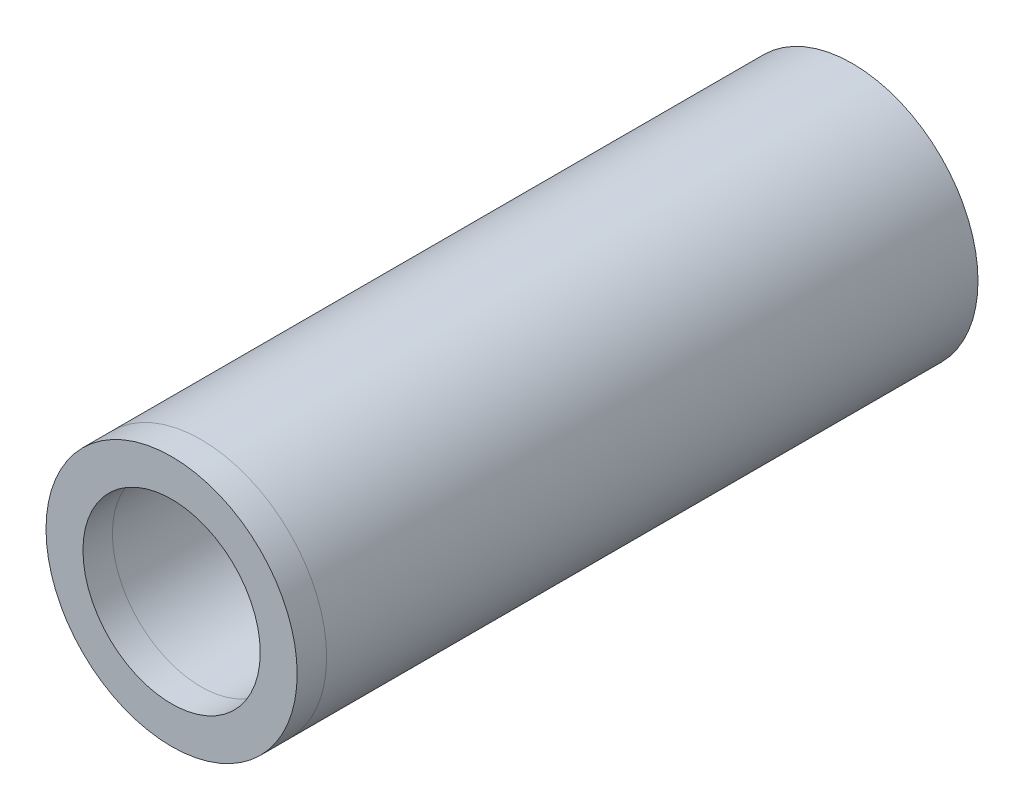
ISO-10303-21;
HEADER;
FILE_DESCRIPTION(('STEP AP214'),'2;1');
FILE_NAME('part.step','',(''),(''),'','','');
FILE_SCHEMA(('AUTOMOTIVE_DESIGN { 1 0 10303 214 1 1 1 1 }'));
ENDSEC;
DATA;
#1=APPLICATION_CONTEXT('core data for automotive mechanical design processes');
#2=APPLICATION_PROTOCOL_DEFINITION('international standard','automotive_design',2000,#1);
#3=PRODUCT_CONTEXT('',#1,'mechanical');
#4=PRODUCT('Part','Part','',(#3));
#5=PRODUCT_RELATED_PRODUCT_CATEGORY('part','',(#4));
#6=PRODUCT_DEFINITION_FORMATION('','',#4);
#7=PRODUCT_DEFINITION_CONTEXT('part definition',#1,'design');
#8=PRODUCT_DEFINITION('design','',#6,#7);
#9=PRODUCT_DEFINITION_SHAPE('','',#8);
#10=(LENGTH_UNIT() NAMED_UNIT(*) SI_UNIT(.MILLI.,.METRE.));
#11=(NAMED_UNIT(*) PLANE_ANGLE_UNIT() SI_UNIT($,.RADIAN.));
#12=(NAMED_UNIT(*) SI_UNIT($,.STERADIAN.) SOLID_ANGLE_UNIT());
#13=UNCERTAINTY_MEASURE_WITH_UNIT(LENGTH_MEASURE(1.E-05),#10,'distance_accuracy_value','');
#14=(GEOMETRIC_REPRESENTATION_CONTEXT(3) GLOBAL_UNCERTAINTY_ASSIGNED_CONTEXT((#13)) GLOBAL_UNIT_ASSIGNED_CONTEXT((#10,
#11,#12)) REPRESENTATION_CONTEXT('',''));
#15=CARTESIAN_POINT('',(0.,0.,0.));
#16=DIRECTION('',(0.,0.,1.));
#17=DIRECTION('',(1.,0.,0.));
#18=AXIS2_PLACEMENT_3D('',#15,#16,#17);
#19=CARTESIAN_POINT('',(-3.14354614503261E-11,0.,0.));
#20=DIRECTION('',(0.,0.,-1.));
#21=DIRECTION('',(-1.,0.,0.));
#22=AXIS2_PLACEMENT_3D('',#19,#20,#21);
#23=PLANE('',#22);
#24=CARTESIAN_POINT('',(-3.14354614503261E-11,0.,0.));
#25=DIRECTION('',(0.,0.,-1.));
#26=DIRECTION('',(-1.,0.,0.));
#27=AXIS2_PLACEMENT_3D('',#24,#25,#26);
#28=CIRCLE('',#27,9.525);
#29=CARTESIAN_POINT('',(-9.52500000003143,0.,0.));
#30=VERTEX_POINT('',#29);
#31=EDGE_CURVE('E71',#30,#30,#28,.T.);
#32=ORIENTED_EDGE('',*,*,#31,.F.);
#33=EDGE_LOOP('',(#32));
#34=FACE_BOUND('',#33,.T.);
#35=CARTESIAN_POINT('',(-3.14354614503261E-11,0.,0.));
#36=DIRECTION('',(0.,0.,-1.));
#37=DIRECTION('',(-1.,0.,0.));
#38=AXIS2_PLACEMENT_3D('',#35,#36,#37);
#39=CIRCLE('',#38,13.49375);
#40=CARTESIAN_POINT('',(-13.4937500000314,0.,0.));
#41=VERTEX_POINT('',#40);
#42=EDGE_CURVE('E67',#41,#41,#39,.T.);
#43=ORIENTED_EDGE('',*,*,#42,.T.);
#44=EDGE_LOOP('',(#43));
#45=FACE_BOUND('',#44,.T.);
#46=ADVANCED_FACE('F57',(#34,#45),#23,.T.);
#47=CARTESIAN_POINT('',(3.00749009030099E-11,0.,73.1504341892945));
#48=DIRECTION('',(0.,0.,-1.));
#49=DIRECTION('',(-1.,0.,0.));
#50=AXIS2_PLACEMENT_3D('',#47,#48,#49);
#51=PLANE('',#50);
#52=CARTESIAN_POINT('',(-1.36056054731628E-12,0.,73.1504341892945));
#53=DIRECTION('',(0.,0.,-1.));
#54=DIRECTION('',(-1.,0.,0.));
#55=AXIS2_PLACEMENT_3D('',#52,#53,#54);
#56=CIRCLE('',#55,9.525);
#57=CARTESIAN_POINT('',(-9.52500000000136,0.,73.1504341892945));
#58=VERTEX_POINT('',#57);
#59=EDGE_CURVE('E76',#58,#58,#56,.T.);
#60=ORIENTED_EDGE('',*,*,#59,.T.);
#61=EDGE_LOOP('',(#60));
#62=FACE_BOUND('',#61,.T.);
#63=CARTESIAN_POINT('',(3.00749009030099E-11,0.,73.1504341892945));
#64=DIRECTION('',(0.,0.,-1.));
#65=DIRECTION('',(-1.,0.,0.));
#66=AXIS2_PLACEMENT_3D('',#63,#64,#65);
#67=CIRCLE('',#66,13.49375);
#68=CARTESIAN_POINT('',(-13.4937499999699,0.,73.1504341892945));
#69=VERTEX_POINT('',#68);
#70=EDGE_CURVE('E11',#69,#69,#67,.T.);
#71=ORIENTED_EDGE('',*,*,#70,.F.);
#72=EDGE_LOOP('',(#71));
#73=FACE_BOUND('',#72,.T.);
#74=ADVANCED_FACE('F83',(#62,#73),#51,.F.);
#75=CARTESIAN_POINT('',(-3.14354614503261E-11,0.,0.));
#76=DIRECTION('',(4.29737181996476E-13,0.,1.));
#77=DIRECTION('',(1.,0.,-4.29737181996476E-13));
#78=AXIS2_PLACEMENT_3D('',#75,#76,#77);
#79=CYLINDRICAL_SURFACE('',#78,13.49375);
#80=CARTESIAN_POINT('',(-1.36056054731617E-12,0.,69.9844048012968));
#81=DIRECTION('',(0.,0.,-1.));
#82=DIRECTION('',(-1.,0.,0.));
#83=AXIS2_PLACEMENT_3D('',#80,#81,#82);
#84=CIRCLE('',#83,13.49375);
#85=CARTESIAN_POINT('',(-13.4937500000014,0.,69.9844048012968));
#86=VERTEX_POINT('',#85);
#87=EDGE_CURVE('E63',#86,#86,#84,.T.);
#88=ORIENTED_EDGE('',*,*,#87,.T.);
#89=EDGE_LOOP('',(#88));
#90=FACE_BOUND('',#89,.T.);
#91=ORIENTED_EDGE('',*,*,#42,.F.);
#92=EDGE_LOOP('',(#91));
#93=FACE_BOUND('',#92,.T.);
#94=ADVANCED_FACE('F103',(#90,#93),#79,.T.);
#95=CARTESIAN_POINT('',(3.00749009030099E-11,0.,69.9844048012968));
#96=DIRECTION('',(0.,0.,1.));
#97=DIRECTION('',(1.,0.,0.));
#98=AXIS2_PLACEMENT_3D('',#95,#96,#97);
#99=CYLINDRICAL_SURFACE('',#98,13.49375);
#100=ORIENTED_EDGE('',*,*,#70,.T.);
#101=EDGE_LOOP('',(#100));
#102=FACE_BOUND('',#101,.T.);
#103=ORIENTED_EDGE('',*,*,#87,.F.);
#104=EDGE_LOOP('',(#103));
#105=FACE_BOUND('',#104,.T.);
#106=ADVANCED_FACE('F95',(#102,#105),#99,.T.);
#107=CARTESIAN_POINT('',(-3.18651986323226E-11,0.,-1.));
#108=DIRECTION('',(4.29737181996476E-13,0.,1.));
#109=DIRECTION('',(1.,0.,-4.29737181996476E-13));
#110=AXIS2_PLACEMENT_3D('',#107,#108,#109);
#111=CYLINDRICAL_SURFACE('',#110,9.525);
#112=CARTESIAN_POINT('',(-1.36056054731618E-12,0.,69.9844048012968));
#113=DIRECTION('',(0.,0.,-1.));
#114=DIRECTION('',(-1.,0.,0.));
#115=AXIS2_PLACEMENT_3D('',#112,#113,#114);
#116=CIRCLE('',#115,9.525);
#117=CARTESIAN_POINT('',(-9.52500000000136,0.,69.9844048012968));
#118=VERTEX_POINT('',#117);
#119=EDGE_CURVE('E77',#118,#118,#116,.T.);
#120=ORIENTED_EDGE('',*,*,#119,.F.);
#121=EDGE_LOOP('',(#120));
#122=FACE_BOUND('',#121,.T.);
#123=ORIENTED_EDGE('',*,*,#31,.T.);
#124=EDGE_LOOP('',(#123));
#125=FACE_BOUND('',#124,.T.);
#126=ADVANCED_FACE('F89',(#122,#125),#111,.F.);
#127=CARTESIAN_POINT('',(-1.36056054731628E-12,0.,69.9844048012968));
#128=DIRECTION('',(0.,0.,1.));
#129=DIRECTION('',(1.,0.,0.));
#130=AXIS2_PLACEMENT_3D('',#127,#128,#129);
#131=CYLINDRICAL_SURFACE('',#130,9.525);
#132=ORIENTED_EDGE('',*,*,#59,.F.);
#133=EDGE_LOOP('',(#132));
#134=FACE_BOUND('',#133,.T.);
#135=ORIENTED_EDGE('',*,*,#119,.T.);
#136=EDGE_LOOP('',(#135));
#137=FACE_BOUND('',#136,.T.);
#138=ADVANCED_FACE('F86',(#134,#137),#131,.F.);
#139=CLOSED_SHELL('',(#46,#74,#94,#106,#126,#138));
#140=MANIFOLD_SOLID_BREP('B2',#139);
#141=ADVANCED_BREP_SHAPE_REPRESENTATION('',(#18,#140),#14);
#142=SHAPE_DEFINITION_REPRESENTATION(#9,#141);
ENDSEC;
END-ISO-10303-21;
